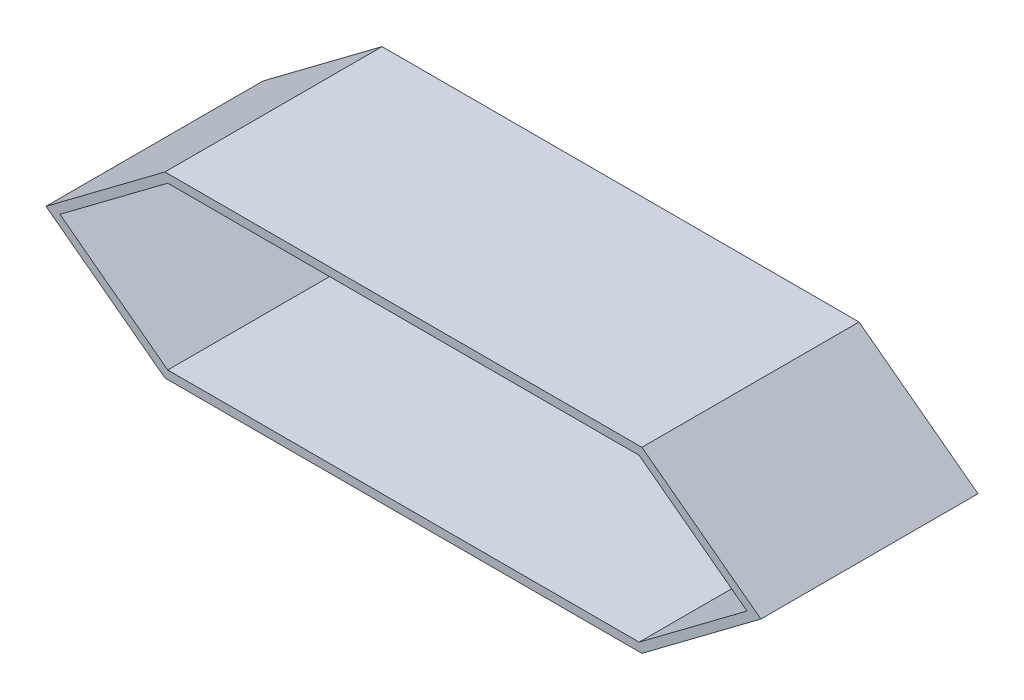
ISO-10303-21;
HEADER;
FILE_DESCRIPTION(('STEP AP214'),'2;1');
FILE_NAME('part.step','',(''),(''),'','','');
FILE_SCHEMA(('AUTOMOTIVE_DESIGN { 1 0 10303 214 1 1 1 1 }'));
ENDSEC;
DATA;
#1=APPLICATION_CONTEXT('core data for automotive mechanical design processes');
#2=APPLICATION_PROTOCOL_DEFINITION('international standard','automotive_design',2000,#1);
#3=PRODUCT_CONTEXT('',#1,'mechanical');
#4=PRODUCT('Part','Part','',(#3));
#5=PRODUCT_RELATED_PRODUCT_CATEGORY('part','',(#4));
#6=PRODUCT_DEFINITION_FORMATION('','',#4);
#7=PRODUCT_DEFINITION_CONTEXT('part definition',#1,'design');
#8=PRODUCT_DEFINITION('design','',#6,#7);
#9=PRODUCT_DEFINITION_SHAPE('','',#8);
#10=(LENGTH_UNIT() NAMED_UNIT(*) SI_UNIT(.MILLI.,.METRE.));
#11=(NAMED_UNIT(*) PLANE_ANGLE_UNIT() SI_UNIT($,.RADIAN.));
#12=(NAMED_UNIT(*) SI_UNIT($,.STERADIAN.) SOLID_ANGLE_UNIT());
#13=UNCERTAINTY_MEASURE_WITH_UNIT(LENGTH_MEASURE(1.E-05),#10,'distance_accuracy_value','');
#14=(GEOMETRIC_REPRESENTATION_CONTEXT(3) GLOBAL_UNCERTAINTY_ASSIGNED_CONTEXT((#13)) GLOBAL_UNIT_ASSIGNED_CONTEXT((#10,
#11,#12)) REPRESENTATION_CONTEXT('',''));
#15=CARTESIAN_POINT('',(0.,0.,0.));
#16=DIRECTION('',(0.,0.,1.));
#17=DIRECTION('',(1.,0.,0.));
#18=AXIS2_PLACEMENT_3D('',#15,#16,#17);
#19=CARTESIAN_POINT('',(-22.85,64.9040885690325,0.8));
#20=DIRECTION('',(0.6,-0.8,0.));
#21=DIRECTION('',(0.8,0.6,0.));
#22=AXIS2_PLACEMENT_3D('',#19,#20,#21);
#23=PLANE('',#22);
#24=DIRECTION('',(-0.8,-0.6,0.));
#25=VECTOR('',#24,1.);
#26=CARTESIAN_POINT('',(-22.85,64.9040885690325,0.));
#27=LINE('',#26,#25);
#28=CARTESIAN_POINT('',(-22.85,64.9040885690325,0.));
#29=VERTEX_POINT('',#28);
#30=CARTESIAN_POINT('',(-34.25,56.3540885690325,0.));
#31=VERTEX_POINT('',#30);
#32=EDGE_CURVE('E195',#29,#31,#27,.T.);
#33=ORIENTED_EDGE('',*,*,#32,.T.);
#34=DIRECTION('',(0.,0.,-1.));
#35=VECTOR('',#34,1.);
#36=CARTESIAN_POINT('',(-34.25,56.3540885690325,0.8));
#37=LINE('',#36,#35);
#38=CARTESIAN_POINT('',(-34.25,56.3540885690325,20.8));
#39=VERTEX_POINT('',#38);
#40=EDGE_CURVE('E11',#39,#31,#37,.T.);
#41=ORIENTED_EDGE('',*,*,#40,.F.);
#42=DIRECTION('',(-0.8,-0.6,0.));
#43=VECTOR('',#42,1.);
#44=CARTESIAN_POINT('',(-22.85,64.9040885690325,20.8));
#45=LINE('',#44,#43);
#46=CARTESIAN_POINT('',(-22.85,64.9040885690325,20.8));
#47=VERTEX_POINT('',#46);
#48=EDGE_CURVE('E186',#47,#39,#45,.T.);
#49=ORIENTED_EDGE('',*,*,#48,.F.);
#50=DIRECTION('',(0.,0.,-1.));
#51=VECTOR('',#50,1.);
#52=CARTESIAN_POINT('',(-22.85,64.9040885690325,0.8));
#53=LINE('',#52,#51);
#54=EDGE_CURVE('E207',#47,#29,#53,.T.);
#55=ORIENTED_EDGE('',*,*,#54,.T.);
#56=EDGE_LOOP('',(#33,#41,#49,#55));
#57=FACE_BOUND('',#56,.T.);
#58=ADVANCED_FACE('F33',(#57),#23,.F.);
#59=CARTESIAN_POINT('',(-22.85,47.8040885690325,0.8));
#60=DIRECTION('',(0.6,0.8,0.));
#61=DIRECTION('',(-0.8,0.6,0.));
#62=AXIS2_PLACEMENT_3D('',#59,#60,#61);
#63=PLANE('',#62);
#64=DIRECTION('',(0.8,-0.6,0.));
#65=VECTOR('',#64,1.);
#66=CARTESIAN_POINT('',(-22.85,47.8040885690325,0.));
#67=LINE('',#66,#65);
#68=CARTESIAN_POINT('',(-22.85,47.8040885690325,0.));
#69=VERTEX_POINT('',#68);
#70=EDGE_CURVE('E198',#31,#69,#67,.T.);
#71=ORIENTED_EDGE('',*,*,#70,.T.);
#72=DIRECTION('',(0.,0.,-1.));
#73=VECTOR('',#72,1.);
#74=CARTESIAN_POINT('',(-22.85,47.8040885690325,0.8));
#75=LINE('',#74,#73);
#76=CARTESIAN_POINT('',(-22.85,47.8040885690325,20.8));
#77=VERTEX_POINT('',#76);
#78=EDGE_CURVE('E40',#77,#69,#75,.T.);
#79=ORIENTED_EDGE('',*,*,#78,.F.);
#80=DIRECTION('',(0.8,-0.6,0.));
#81=VECTOR('',#80,1.);
#82=CARTESIAN_POINT('',(-34.25,56.3540885690325,20.8));
#83=LINE('',#82,#81);
#84=EDGE_CURVE('E189',#39,#77,#83,.T.);
#85=ORIENTED_EDGE('',*,*,#84,.F.);
#86=ORIENTED_EDGE('',*,*,#40,.T.);
#87=EDGE_LOOP('',(#71,#79,#85,#86));
#88=FACE_BOUND('',#87,.T.);
#89=ADVANCED_FACE('F237',(#88),#63,.F.);
#90=CARTESIAN_POINT('',(22.85,47.8040885690325,0.8));
#91=DIRECTION('',(0.,1.,0.));
#92=DIRECTION('',(0.,0.,1.));
#93=AXIS2_PLACEMENT_3D('',#90,#91,#92);
#94=PLANE('',#93);
#95=DIRECTION('',(1.,0.,0.));
#96=VECTOR('',#95,1.);
#97=CARTESIAN_POINT('',(22.85,47.8040885690325,0.));
#98=LINE('',#97,#96);
#99=CARTESIAN_POINT('',(22.85,47.8040885690325,0.));
#100=VERTEX_POINT('',#99);
#101=EDGE_CURVE('E200',#69,#100,#98,.T.);
#102=ORIENTED_EDGE('',*,*,#101,.T.);
#103=DIRECTION('',(0.,0.,-1.));
#104=VECTOR('',#103,1.);
#105=CARTESIAN_POINT('',(22.85,47.8040885690325,0.8));
#106=LINE('',#105,#104);
#107=CARTESIAN_POINT('',(22.85,47.8040885690325,20.8));
#108=VERTEX_POINT('',#107);
#109=EDGE_CURVE('E214',#108,#100,#106,.T.);
#110=ORIENTED_EDGE('',*,*,#109,.F.);
#111=DIRECTION('',(1.,0.,0.));
#112=VECTOR('',#111,1.);
#113=CARTESIAN_POINT('',(-22.85,47.8040885690325,20.8));
#114=LINE('',#113,#112);
#115=EDGE_CURVE('E192',#77,#108,#114,.T.);
#116=ORIENTED_EDGE('',*,*,#115,.F.);
#117=ORIENTED_EDGE('',*,*,#78,.T.);
#118=EDGE_LOOP('',(#102,#110,#116,#117));
#119=FACE_BOUND('',#118,.T.);
#120=ADVANCED_FACE('F220',(#119),#94,.F.);
#121=CARTESIAN_POINT('',(22.85,47.8040885690325,0.8));
#122=DIRECTION('',(-0.6,0.8,0.));
#123=DIRECTION('',(-0.8,-0.6,0.));
#124=AXIS2_PLACEMENT_3D('',#121,#122,#123);
#125=PLANE('',#124);
#126=DIRECTION('',(0.8,0.6,0.));
#127=VECTOR('',#126,1.);
#128=CARTESIAN_POINT('',(22.85,47.8040885690325,0.));
#129=LINE('',#128,#127);
#130=CARTESIAN_POINT('',(34.25,56.3540885690325,0.));
#131=VERTEX_POINT('',#130);
#132=EDGE_CURVE('E202',#100,#131,#129,.T.);
#133=ORIENTED_EDGE('',*,*,#132,.T.);
#134=DIRECTION('',(0.,0.,-1.));
#135=VECTOR('',#134,1.);
#136=CARTESIAN_POINT('',(34.25,56.3540885690325,0.8));
#137=LINE('',#136,#135);
#138=CARTESIAN_POINT('',(34.25,56.3540885690325,20.8));
#139=VERTEX_POINT('',#138);
#140=EDGE_CURVE('E211',#139,#131,#137,.T.);
#141=ORIENTED_EDGE('',*,*,#140,.F.);
#142=DIRECTION('',(0.8,0.6,0.));
#143=VECTOR('',#142,1.);
#144=CARTESIAN_POINT('',(22.85,47.8040885690325,20.8));
#145=LINE('',#144,#143);
#146=EDGE_CURVE('E139',#108,#139,#145,.T.);
#147=ORIENTED_EDGE('',*,*,#146,.F.);
#148=ORIENTED_EDGE('',*,*,#109,.T.);
#149=EDGE_LOOP('',(#133,#141,#147,#148));
#150=FACE_BOUND('',#149,.T.);
#151=ADVANCED_FACE('F229',(#150),#125,.F.);
#152=CARTESIAN_POINT('',(22.85,64.9040885690325,0.8));
#153=DIRECTION('',(-0.6,-0.8,0.));
#154=DIRECTION('',(0.8,-0.6,0.));
#155=AXIS2_PLACEMENT_3D('',#152,#153,#154);
#156=PLANE('',#155);
#157=DIRECTION('',(-0.8,0.6,0.));
#158=VECTOR('',#157,1.);
#159=CARTESIAN_POINT('',(22.85,64.9040885690325,0.));
#160=LINE('',#159,#158);
#161=CARTESIAN_POINT('',(22.85,64.9040885690325,0.));
#162=VERTEX_POINT('',#161);
#163=EDGE_CURVE('E204',#131,#162,#160,.T.);
#164=ORIENTED_EDGE('',*,*,#163,.T.);
#165=DIRECTION('',(0.,0.,-1.));
#166=VECTOR('',#165,1.);
#167=CARTESIAN_POINT('',(22.85,64.9040885690325,0.8));
#168=LINE('',#167,#166);
#169=CARTESIAN_POINT('',(22.85,64.9040885690325,20.8));
#170=VERTEX_POINT('',#169);
#171=EDGE_CURVE('E209',#170,#162,#168,.T.);
#172=ORIENTED_EDGE('',*,*,#171,.F.);
#173=DIRECTION('',(-0.8,0.6,0.));
#174=VECTOR('',#173,1.);
#175=CARTESIAN_POINT('',(34.25,56.3540885690325,20.8));
#176=LINE('',#175,#174);
#177=EDGE_CURVE('E180',#139,#170,#176,.T.);
#178=ORIENTED_EDGE('',*,*,#177,.F.);
#179=ORIENTED_EDGE('',*,*,#140,.T.);
#180=EDGE_LOOP('',(#164,#172,#178,#179));
#181=FACE_BOUND('',#180,.T.);
#182=ADVANCED_FACE('F233',(#181),#156,.F.);
#183=CARTESIAN_POINT('',(22.85,64.9040885690325,0.8));
#184=DIRECTION('',(0.,-1.,0.));
#185=DIRECTION('',(0.,0.,-1.));
#186=AXIS2_PLACEMENT_3D('',#183,#184,#185);
#187=PLANE('',#186);
#188=DIRECTION('',(-1.,0.,0.));
#189=VECTOR('',#188,1.);
#190=CARTESIAN_POINT('',(22.85,64.9040885690325,0.));
#191=LINE('',#190,#189);
#192=EDGE_CURVE('E55',#162,#29,#191,.T.);
#193=ORIENTED_EDGE('',*,*,#192,.T.);
#194=ORIENTED_EDGE('',*,*,#54,.F.);
#195=DIRECTION('',(-1.,0.,0.));
#196=VECTOR('',#195,1.);
#197=CARTESIAN_POINT('',(22.85,64.9040885690325,20.8));
#198=LINE('',#197,#196);
#199=EDGE_CURVE('E183',#170,#47,#198,.T.);
#200=ORIENTED_EDGE('',*,*,#199,.F.);
#201=ORIENTED_EDGE('',*,*,#171,.T.);
#202=EDGE_LOOP('',(#193,#194,#200,#201));
#203=FACE_BOUND('',#202,.T.);
#204=ADVANCED_FACE('F239',(#203),#187,.F.);
#205=CARTESIAN_POINT('',(0.,0.,0.));
#206=DIRECTION('',(0.,0.,-1.));
#207=DIRECTION('',(-1.,0.,0.));
#208=AXIS2_PLACEMENT_3D('',#205,#206,#207);
#209=PLANE('',#208);
#210=ORIENTED_EDGE('',*,*,#32,.F.);
#211=ORIENTED_EDGE('',*,*,#192,.F.);
#212=ORIENTED_EDGE('',*,*,#163,.F.);
#213=ORIENTED_EDGE('',*,*,#132,.F.);
#214=ORIENTED_EDGE('',*,*,#101,.F.);
#215=ORIENTED_EDGE('',*,*,#70,.F.);
#216=EDGE_LOOP('',(#210,#211,#212,#213,#214,#215));
#217=FACE_BOUND('',#216,.T.);
#218=ADVANCED_FACE('F226',(#217),#209,.T.);
#219=CARTESIAN_POINT('',(0.,0.,20.8));
#220=DIRECTION('',(0.,0.,1.));
#221=DIRECTION('',(1.,0.,0.));
#222=AXIS2_PLACEMENT_3D('',#219,#220,#221);
#223=PLANE('',#222);
#224=ORIENTED_EDGE('',*,*,#146,.T.);
#225=ORIENTED_EDGE('',*,*,#177,.T.);
#226=ORIENTED_EDGE('',*,*,#199,.T.);
#227=ORIENTED_EDGE('',*,*,#48,.T.);
#228=ORIENTED_EDGE('',*,*,#84,.T.);
#229=ORIENTED_EDGE('',*,*,#115,.T.);
#230=EDGE_LOOP('',(#224,#225,#226,#227,#228,#229));
#231=FACE_BOUND('',#230,.T.);
#232=DIRECTION('',(-0.8,-0.6,0.));
#233=VECTOR('',#232,1.);
#234=CARTESIAN_POINT('',(-22.5833333333333,64.1040885690325,20.8));
#235=LINE('',#234,#233);
#236=CARTESIAN_POINT('',(-22.5833333333333,64.1040885690325,20.8));
#237=VERTEX_POINT('',#236);
#238=CARTESIAN_POINT('',(-32.9166666666667,56.3540885690325,20.8));
#239=VERTEX_POINT('',#238);
#240=EDGE_CURVE('E131',#237,#239,#235,.T.);
#241=ORIENTED_EDGE('',*,*,#240,.F.);
#242=DIRECTION('',(-1.,0.,0.));
#243=VECTOR('',#242,1.);
#244=CARTESIAN_POINT('',(22.5833333333333,64.1040885690325,20.8));
#245=LINE('',#244,#243);
#246=CARTESIAN_POINT('',(22.5833333333333,64.1040885690325,20.8));
#247=VERTEX_POINT('',#246);
#248=EDGE_CURVE('E123',#247,#237,#245,.T.);
#249=ORIENTED_EDGE('',*,*,#248,.F.);
#250=DIRECTION('',(-0.8,0.6,0.));
#251=VECTOR('',#250,1.);
#252=CARTESIAN_POINT('',(32.9166666666667,56.3540885690325,20.8));
#253=LINE('',#252,#251);
#254=CARTESIAN_POINT('',(32.9166666666667,56.3540885690325,20.8));
#255=VERTEX_POINT('',#254);
#256=EDGE_CURVE('E154',#255,#247,#253,.T.);
#257=ORIENTED_EDGE('',*,*,#256,.F.);
#258=DIRECTION('',(0.8,0.6,0.));
#259=VECTOR('',#258,1.);
#260=CARTESIAN_POINT('',(22.5833333333333,48.6040885690325,20.8));
#261=LINE('',#260,#259);
#262=CARTESIAN_POINT('',(22.5833333333333,48.6040885690325,20.8));
#263=VERTEX_POINT('',#262);
#264=EDGE_CURVE('E151',#263,#255,#261,.T.);
#265=ORIENTED_EDGE('',*,*,#264,.F.);
#266=DIRECTION('',(1.,0.,0.));
#267=VECTOR('',#266,1.);
#268=CARTESIAN_POINT('',(-22.5833333333333,48.6040885690325,20.8));
#269=LINE('',#268,#267);
#270=CARTESIAN_POINT('',(-22.5833333333333,48.6040885690325,20.8));
#271=VERTEX_POINT('',#270);
#272=EDGE_CURVE('E147',#271,#263,#269,.T.);
#273=ORIENTED_EDGE('',*,*,#272,.F.);
#274=DIRECTION('',(0.8,-0.6,0.));
#275=VECTOR('',#274,1.);
#276=CARTESIAN_POINT('',(-32.9166666666667,56.3540885690325,20.8));
#277=LINE('',#276,#275);
#278=EDGE_CURVE('E145',#239,#271,#277,.T.);
#279=ORIENTED_EDGE('',*,*,#278,.F.);
#280=EDGE_LOOP('',(#241,#249,#257,#265,#273,#279));
#281=FACE_BOUND('',#280,.T.);
#282=ADVANCED_FACE('F143',(#231,#281),#223,.T.);
#283=CARTESIAN_POINT('',(22.5833333333333,64.1040885690325,20.8));
#284=DIRECTION('',(0.,-1.,0.));
#285=DIRECTION('',(0.,0.,-1.));
#286=AXIS2_PLACEMENT_3D('',#283,#284,#285);
#287=PLANE('',#286);
#288=DIRECTION('',(-1.,0.,0.));
#289=VECTOR('',#288,1.);
#290=CARTESIAN_POINT('',(22.5833333333333,64.1040885690325,0.8));
#291=LINE('',#290,#289);
#292=CARTESIAN_POINT('',(22.5833333333333,64.1040885690325,0.8));
#293=VERTEX_POINT('',#292);
#294=CARTESIAN_POINT('',(-22.5833333333333,64.1040885690325,0.8));
#295=VERTEX_POINT('',#294);
#296=EDGE_CURVE('E156',#293,#295,#291,.T.);
#297=ORIENTED_EDGE('',*,*,#296,.F.);
#298=DIRECTION('',(0.,0.,-1.));
#299=VECTOR('',#298,1.);
#300=CARTESIAN_POINT('',(22.5833333333333,64.1040885690325,20.8));
#301=LINE('',#300,#299);
#302=EDGE_CURVE('E47',#247,#293,#301,.T.);
#303=ORIENTED_EDGE('',*,*,#302,.F.);
#304=ORIENTED_EDGE('',*,*,#248,.T.);
#305=DIRECTION('',(0.,0.,-1.));
#306=VECTOR('',#305,1.);
#307=CARTESIAN_POINT('',(-22.5833333333333,64.1040885690325,20.8));
#308=LINE('',#307,#306);
#309=EDGE_CURVE('E126',#237,#295,#308,.T.);
#310=ORIENTED_EDGE('',*,*,#309,.T.);
#311=EDGE_LOOP('',(#297,#303,#304,#310));
#312=FACE_BOUND('',#311,.T.);
#313=ADVANCED_FACE('F125',(#312),#287,.T.);
#314=CARTESIAN_POINT('',(-22.5833333333333,64.1040885690325,20.8));
#315=DIRECTION('',(0.6,-0.8,0.));
#316=DIRECTION('',(0.8,0.6,0.));
#317=AXIS2_PLACEMENT_3D('',#314,#315,#316);
#318=PLANE('',#317);
#319=DIRECTION('',(-0.8,-0.6,0.));
#320=VECTOR('',#319,1.);
#321=CARTESIAN_POINT('',(-22.5833333333333,64.1040885690325,0.8));
#322=LINE('',#321,#320);
#323=CARTESIAN_POINT('',(-32.9166666666667,56.3540885690325,0.8));
#324=VERTEX_POINT('',#323);
#325=EDGE_CURVE('E138',#295,#324,#322,.T.);
#326=ORIENTED_EDGE('',*,*,#325,.F.);
#327=ORIENTED_EDGE('',*,*,#309,.F.);
#328=ORIENTED_EDGE('',*,*,#240,.T.);
#329=DIRECTION('',(0.,0.,-1.));
#330=VECTOR('',#329,1.);
#331=CARTESIAN_POINT('',(-32.9166666666667,56.3540885690325,20.8));
#332=LINE('',#331,#330);
#333=EDGE_CURVE('E140',#239,#324,#332,.T.);
#334=ORIENTED_EDGE('',*,*,#333,.T.);
#335=EDGE_LOOP('',(#326,#327,#328,#334));
#336=FACE_BOUND('',#335,.T.);
#337=ADVANCED_FACE('F135',(#336),#318,.T.);
#338=CARTESIAN_POINT('',(-32.9166666666667,56.3540885690325,20.8));
#339=DIRECTION('',(0.6,0.8,0.));
#340=DIRECTION('',(-0.8,0.6,0.));
#341=AXIS2_PLACEMENT_3D('',#338,#339,#340);
#342=PLANE('',#341);
#343=DIRECTION('',(0.8,-0.6,0.));
#344=VECTOR('',#343,1.);
#345=CARTESIAN_POINT('',(-32.9166666666667,56.3540885690325,0.8));
#346=LINE('',#345,#344);
#347=CARTESIAN_POINT('',(-22.5833333333333,48.6040885690325,0.8));
#348=VERTEX_POINT('',#347);
#349=EDGE_CURVE('E159',#324,#348,#346,.T.);
#350=ORIENTED_EDGE('',*,*,#349,.F.);
#351=ORIENTED_EDGE('',*,*,#333,.F.);
#352=ORIENTED_EDGE('',*,*,#278,.T.);
#353=DIRECTION('',(0.,0.,-1.));
#354=VECTOR('',#353,1.);
#355=CARTESIAN_POINT('',(-22.5833333333333,48.6040885690325,20.8));
#356=LINE('',#355,#354);
#357=EDGE_CURVE('E175',#271,#348,#356,.T.);
#358=ORIENTED_EDGE('',*,*,#357,.T.);
#359=EDGE_LOOP('',(#350,#351,#352,#358));
#360=FACE_BOUND('',#359,.T.);
#361=ADVANCED_FACE('F297',(#360),#342,.T.);
#362=CARTESIAN_POINT('',(-22.5833333333333,48.6040885690325,20.8));
#363=DIRECTION('',(0.,1.,0.));
#364=DIRECTION('',(0.,0.,1.));
#365=AXIS2_PLACEMENT_3D('',#362,#363,#364);
#366=PLANE('',#365);
#367=DIRECTION('',(1.,0.,0.));
#368=VECTOR('',#367,1.);
#369=CARTESIAN_POINT('',(-22.5833333333333,48.6040885690325,0.8));
#370=LINE('',#369,#368);
#371=CARTESIAN_POINT('',(22.5833333333333,48.6040885690325,0.8));
#372=VERTEX_POINT('',#371);
#373=EDGE_CURVE('E162',#348,#372,#370,.T.);
#374=ORIENTED_EDGE('',*,*,#373,.F.);
#375=ORIENTED_EDGE('',*,*,#357,.F.);
#376=ORIENTED_EDGE('',*,*,#272,.T.);
#377=DIRECTION('',(0.,0.,-1.));
#378=VECTOR('',#377,1.);
#379=CARTESIAN_POINT('',(22.5833333333333,48.6040885690325,20.8));
#380=LINE('',#379,#378);
#381=EDGE_CURVE('E173',#263,#372,#380,.T.);
#382=ORIENTED_EDGE('',*,*,#381,.T.);
#383=EDGE_LOOP('',(#374,#375,#376,#382));
#384=FACE_BOUND('',#383,.T.);
#385=ADVANCED_FACE('F306',(#384),#366,.T.);
#386=CARTESIAN_POINT('',(22.5833333333333,48.6040885690325,20.8));
#387=DIRECTION('',(-0.6,0.8,0.));
#388=DIRECTION('',(-0.8,-0.6,0.));
#389=AXIS2_PLACEMENT_3D('',#386,#387,#388);
#390=PLANE('',#389);
#391=DIRECTION('',(0.8,0.6,0.));
#392=VECTOR('',#391,1.);
#393=CARTESIAN_POINT('',(22.5833333333333,48.6040885690325,0.8));
#394=LINE('',#393,#392);
#395=CARTESIAN_POINT('',(32.9166666666667,56.3540885690325,0.8));
#396=VERTEX_POINT('',#395);
#397=EDGE_CURVE('E165',#372,#396,#394,.T.);
#398=ORIENTED_EDGE('',*,*,#397,.F.);
#399=ORIENTED_EDGE('',*,*,#381,.F.);
#400=ORIENTED_EDGE('',*,*,#264,.T.);
#401=DIRECTION('',(0.,0.,-1.));
#402=VECTOR('',#401,1.);
#403=CARTESIAN_POINT('',(32.9166666666667,56.3540885690325,20.8));
#404=LINE('',#403,#402);
#405=EDGE_CURVE('E171',#255,#396,#404,.T.);
#406=ORIENTED_EDGE('',*,*,#405,.T.);
#407=EDGE_LOOP('',(#398,#399,#400,#406));
#408=FACE_BOUND('',#407,.T.);
#409=ADVANCED_FACE('F316',(#408),#390,.T.);
#410=CARTESIAN_POINT('',(32.9166666666667,56.3540885690325,20.8));
#411=DIRECTION('',(-0.6,-0.8,0.));
#412=DIRECTION('',(0.8,-0.6,0.));
#413=AXIS2_PLACEMENT_3D('',#410,#411,#412);
#414=PLANE('',#413);
#415=DIRECTION('',(-0.8,0.6,0.));
#416=VECTOR('',#415,1.);
#417=CARTESIAN_POINT('',(32.9166666666667,56.3540885690325,0.8));
#418=LINE('',#417,#416);
#419=EDGE_CURVE('E132',#396,#293,#418,.T.);
#420=ORIENTED_EDGE('',*,*,#419,.F.);
#421=ORIENTED_EDGE('',*,*,#405,.F.);
#422=ORIENTED_EDGE('',*,*,#256,.T.);
#423=ORIENTED_EDGE('',*,*,#302,.T.);
#424=EDGE_LOOP('',(#420,#421,#422,#423));
#425=FACE_BOUND('',#424,.T.);
#426=ADVANCED_FACE('F326',(#425),#414,.T.);
#427=CARTESIAN_POINT('',(0.,0.,0.8));
#428=DIRECTION('',(0.,0.,-1.));
#429=DIRECTION('',(-1.,0.,0.));
#430=AXIS2_PLACEMENT_3D('',#427,#428,#429);
#431=PLANE('',#430);
#432=ORIENTED_EDGE('',*,*,#419,.T.);
#433=ORIENTED_EDGE('',*,*,#296,.T.);
#434=ORIENTED_EDGE('',*,*,#325,.T.);
#435=ORIENTED_EDGE('',*,*,#349,.T.);
#436=ORIENTED_EDGE('',*,*,#373,.T.);
#437=ORIENTED_EDGE('',*,*,#397,.T.);
#438=EDGE_LOOP('',(#432,#433,#434,#435,#436,#437));
#439=FACE_BOUND('',#438,.T.);
#440=ADVANCED_FACE('F336',(#439),#431,.F.);
#441=CLOSED_SHELL('',(#58,#89,#120,#151,#182,#204,#218,#282,#313,#337,#361,#385,#409,#426,#440));
#442=MANIFOLD_SOLID_BREP('B2',#441);
#443=ADVANCED_BREP_SHAPE_REPRESENTATION('',(#18,#442),#14);
#444=SHAPE_DEFINITION_REPRESENTATION(#9,#443);
ENDSEC;
END-ISO-10303-21;
